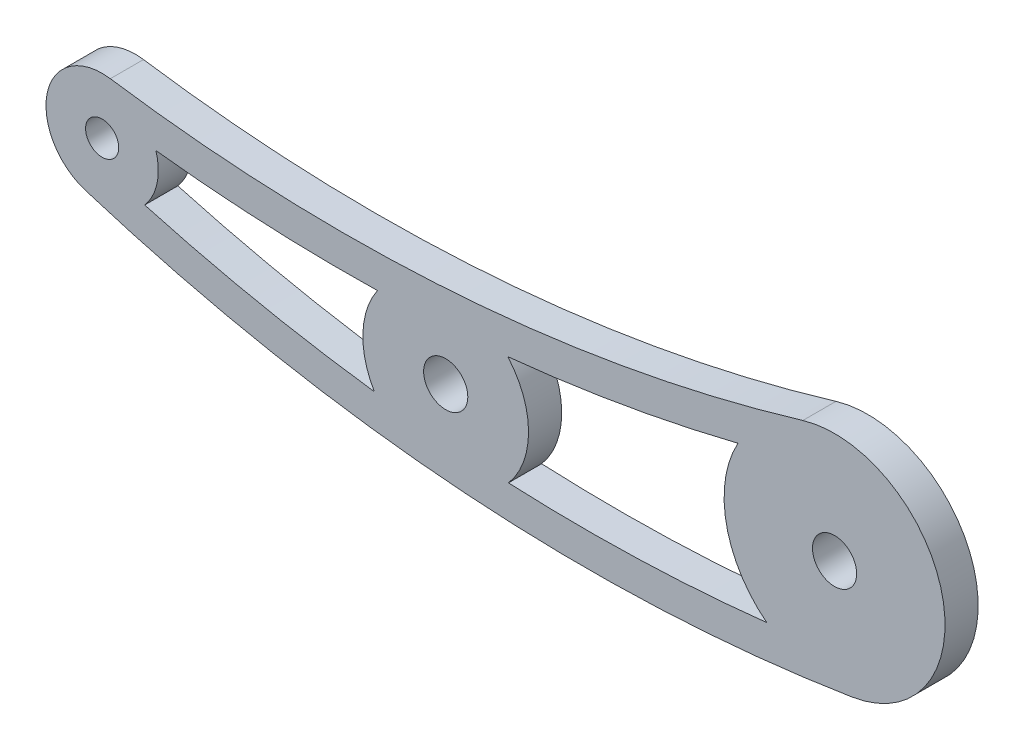
ISO-10303-21;
HEADER;
FILE_DESCRIPTION(('STEP AP214'),'2;1');
FILE_NAME('part.step','',(''),(''),'','','');
FILE_SCHEMA(('AUTOMOTIVE_DESIGN { 1 0 10303 214 1 1 1 1 }'));
ENDSEC;
DATA;
#1=APPLICATION_CONTEXT('core data for automotive mechanical design processes');
#2=APPLICATION_PROTOCOL_DEFINITION('international standard','automotive_design',2000,#1);
#3=PRODUCT_CONTEXT('',#1,'mechanical');
#4=PRODUCT('Part','Part','',(#3));
#5=PRODUCT_RELATED_PRODUCT_CATEGORY('part','',(#4));
#6=PRODUCT_DEFINITION_FORMATION('','',#4);
#7=PRODUCT_DEFINITION_CONTEXT('part definition',#1,'design');
#8=PRODUCT_DEFINITION('design','',#6,#7);
#9=PRODUCT_DEFINITION_SHAPE('','',#8);
#10=(LENGTH_UNIT() NAMED_UNIT(*) SI_UNIT(.MILLI.,.METRE.));
#11=(NAMED_UNIT(*) PLANE_ANGLE_UNIT() SI_UNIT($,.RADIAN.));
#12=(NAMED_UNIT(*) SI_UNIT($,.STERADIAN.) SOLID_ANGLE_UNIT());
#13=UNCERTAINTY_MEASURE_WITH_UNIT(LENGTH_MEASURE(1.E-05),#10,'distance_accuracy_value','');
#14=(GEOMETRIC_REPRESENTATION_CONTEXT(3) GLOBAL_UNCERTAINTY_ASSIGNED_CONTEXT((#13)) GLOBAL_UNIT_ASSIGNED_CONTEXT((#10,
#11,#12)) REPRESENTATION_CONTEXT('',''));
#15=CARTESIAN_POINT('',(0.,0.,0.));
#16=DIRECTION('',(0.,0.,1.));
#17=DIRECTION('',(1.,0.,0.));
#18=AXIS2_PLACEMENT_3D('',#15,#16,#17);
#19=CARTESIAN_POINT('',(0.,0.,3.));
#20=DIRECTION('',(0.,0.,-1.));
#21=DIRECTION('',(-1.,0.,0.));
#22=AXIS2_PLACEMENT_3D('',#19,#20,#21);
#23=CYLINDRICAL_SURFACE('',#22,5.08347455034873);
#24=DIRECTION('',(0.,0.,1.));
#25=VECTOR('',#24,1.);
#26=CARTESIAN_POINT('',(0.742030741321678,5.02902613663687,0.));
#27=LINE('',#26,#25);
#28=CARTESIAN_POINT('',(0.742030741321678,5.02902613663687,0.));
#29=VERTEX_POINT('',#28);
#30=CARTESIAN_POINT('',(0.742030741321678,5.02902613663687,3.));
#31=VERTEX_POINT('',#30);
#32=EDGE_CURVE('E179',#29,#31,#27,.T.);
#33=ORIENTED_EDGE('',*,*,#32,.F.);
#34=CARTESIAN_POINT('',(0.,0.,0.));
#35=DIRECTION('',(0.,0.,1.));
#36=DIRECTION('',(1.,0.,0.));
#37=AXIS2_PLACEMENT_3D('',#34,#35,#36);
#38=CIRCLE('',#37,5.08347455034873);
#39=CARTESIAN_POINT('',(-1.52361416751216,-4.84977456925589,0.));
#40=VERTEX_POINT('',#39);
#41=EDGE_CURVE('E189',#29,#40,#38,.T.);
#42=ORIENTED_EDGE('',*,*,#41,.T.);
#43=DIRECTION('',(0.,0.,1.));
#44=VECTOR('',#43,1.);
#45=CARTESIAN_POINT('',(-1.52361416751216,-4.84977456925589,0.));
#46=LINE('',#45,#44);
#47=CARTESIAN_POINT('',(-1.52361416751216,-4.84977456925589,3.));
#48=VERTEX_POINT('',#47);
#49=EDGE_CURVE('E192',#40,#48,#46,.T.);
#50=ORIENTED_EDGE('',*,*,#49,.T.);
#51=CARTESIAN_POINT('',(0.,0.,3.));
#52=DIRECTION('',(0.,0.,1.));
#53=DIRECTION('',(1.,0.,0.));
#54=AXIS2_PLACEMENT_3D('',#51,#52,#53);
#55=CIRCLE('',#54,5.08347455034873);
#56=EDGE_CURVE('E197',#31,#48,#55,.T.);
#57=ORIENTED_EDGE('',*,*,#56,.F.);
#58=EDGE_LOOP('',(#33,#42,#50,#57));
#59=FACE_BOUND('',#58,.T.);
#60=ADVANCED_FACE('F32',(#59),#23,.T.);
#61=CARTESIAN_POINT('',(0.,0.,3.));
#62=DIRECTION('',(0.,0.,-1.));
#63=DIRECTION('',(-1.,0.,0.));
#64=AXIS2_PLACEMENT_3D('',#61,#62,#63);
#65=CYLINDRICAL_SURFACE('',#64,1.5);
#66=CARTESIAN_POINT('',(0.,0.,3.));
#67=DIRECTION('',(0.,0.,1.));
#68=DIRECTION('',(1.,0.,0.));
#69=AXIS2_PLACEMENT_3D('',#66,#67,#68);
#70=CIRCLE('',#69,1.5);
#71=CARTESIAN_POINT('',(1.5,0.,3.));
#72=VERTEX_POINT('',#71);
#73=EDGE_CURVE('E199',#72,#72,#70,.T.);
#74=ORIENTED_EDGE('',*,*,#73,.T.);
#75=EDGE_LOOP('',(#74));
#76=FACE_BOUND('',#75,.T.);
#77=CARTESIAN_POINT('',(0.,0.,0.));
#78=DIRECTION('',(0.,0.,1.));
#79=DIRECTION('',(1.,0.,0.));
#80=AXIS2_PLACEMENT_3D('',#77,#78,#79);
#81=CIRCLE('',#80,1.5);
#82=CARTESIAN_POINT('',(1.5,0.,0.));
#83=VERTEX_POINT('',#82);
#84=EDGE_CURVE('E208',#83,#83,#81,.T.);
#85=ORIENTED_EDGE('',*,*,#84,.F.);
#86=EDGE_LOOP('',(#85));
#87=FACE_BOUND('',#86,.T.);
#88=ADVANCED_FACE('F249',(#76,#87),#65,.F.);
#89=CARTESIAN_POINT('',(66.3,0.,3.));
#90=DIRECTION('',(0.,0.,-1.));
#91=DIRECTION('',(-1.,0.,0.));
#92=AXIS2_PLACEMENT_3D('',#89,#90,#91);
#93=CYLINDRICAL_SURFACE('',#92,2.);
#94=CARTESIAN_POINT('',(66.3,0.,3.));
#95=DIRECTION('',(0.,0.,1.));
#96=DIRECTION('',(1.,0.,0.));
#97=AXIS2_PLACEMENT_3D('',#94,#95,#96);
#98=CIRCLE('',#97,2.);
#99=CARTESIAN_POINT('',(68.3,0.,3.));
#100=VERTEX_POINT('',#99);
#101=EDGE_CURVE('E203',#100,#100,#98,.T.);
#102=ORIENTED_EDGE('',*,*,#101,.T.);
#103=EDGE_LOOP('',(#102));
#104=FACE_BOUND('',#103,.T.);
#105=CARTESIAN_POINT('',(66.3,0.,0.));
#106=DIRECTION('',(0.,0.,1.));
#107=DIRECTION('',(1.,0.,0.));
#108=AXIS2_PLACEMENT_3D('',#105,#106,#107);
#109=CIRCLE('',#108,2.);
#110=CARTESIAN_POINT('',(68.3,0.,0.));
#111=VERTEX_POINT('',#110);
#112=EDGE_CURVE('E200',#111,#111,#109,.T.);
#113=ORIENTED_EDGE('',*,*,#112,.F.);
#114=EDGE_LOOP('',(#113));
#115=FACE_BOUND('',#114,.T.);
#116=ADVANCED_FACE('F254',(#104,#115),#93,.F.);
#117=CARTESIAN_POINT('',(33.1500000000001,-229.725921356237,3.));
#118=DIRECTION('',(0.,0.,1.));
#119=DIRECTION('',(1.,0.,0.));
#120=AXIS2_PLACEMENT_3D('',#117,#118,#119);
#121=PLANE('',#120);
#122=CARTESIAN_POINT('',(31.1,-3.74,3.));
#123=DIRECTION('',(0.,0.,1.));
#124=DIRECTION('',(1.,0.,0.));
#125=AXIS2_PLACEMENT_3D('',#122,#123,#124);
#126=CIRCLE('',#125,2.);
#127=CARTESIAN_POINT('',(33.1,-3.74,3.));
#128=VERTEX_POINT('',#127);
#129=EDGE_CURVE('E389',#128,#128,#126,.T.);
#130=ORIENTED_EDGE('',*,*,#129,.F.);
#131=EDGE_LOOP('',(#130));
#132=FACE_BOUND('',#131,.T.);
#133=CARTESIAN_POINT('',(43.806101944885,139.438004529346,3.));
#134=DIRECTION('',(0.,0.,1.));
#135=DIRECTION('',(1.,0.,0.));
#136=AXIS2_PLACEMENT_3D('',#133,#134,#135);
#137=CIRCLE('',#136,148.240690159882);
#138=CARTESIAN_POINT('',(3.85218516838753,-3.3169840114924,3.));
#139=VERTEX_POINT('',#138);
#140=CARTESIAN_POINT('',(24.6452263393288,-7.5591487257649,3.));
#141=VERTEX_POINT('',#140);
#142=EDGE_CURVE('E47',#139,#141,#137,.T.);
#143=ORIENTED_EDGE('',*,*,#142,.F.);
#144=CARTESIAN_POINT('',(0.,0.,3.));
#145=DIRECTION('',(0.,0.,-1.));
#146=DIRECTION('',(1.,0.,0.));
#147=AXIS2_PLACEMENT_3D('',#144,#145,#146);
#148=CIRCLE('',#147,5.08347455034852);
#149=CARTESIAN_POINT('',(4.86926369041765,1.46013171228607,3.));
#150=VERTEX_POINT('',#149);
#151=EDGE_CURVE('E140',#150,#139,#148,.T.);
#152=ORIENTED_EDGE('',*,*,#151,.F.);
#153=CARTESIAN_POINT('',(21.8615379379878,148.164003935193,3.));
#154=DIRECTION('',(0.,0.,-1.));
#155=DIRECTION('',(1.,0.,0.));
#156=AXIS2_PLACEMENT_3D('',#153,#154,#155);
#157=CIRCLE('',#156,147.684675946083);
#158=CARTESIAN_POINT('',(24.9211005926827,0.511023654869408,3.));
#159=VERTEX_POINT('',#158);
#160=EDGE_CURVE('E124',#159,#150,#157,.T.);
#161=ORIENTED_EDGE('',*,*,#160,.F.);
#162=CARTESIAN_POINT('',(31.1,-3.74,3.));
#163=DIRECTION('',(0.,0.,-1.));
#164=DIRECTION('',(1.,0.,0.));
#165=AXIS2_PLACEMENT_3D('',#162,#163,#164);
#166=CIRCLE('',#165,7.50000000000038);
#167=EDGE_CURVE('E133',#141,#159,#166,.T.);
#168=ORIENTED_EDGE('',*,*,#167,.F.);
#169=EDGE_LOOP('',(#143,#152,#161,#168));
#170=FACE_BOUND('',#169,.T.);
#171=CARTESIAN_POINT('',(31.1,-3.74,3.));
#172=DIRECTION('',(0.,0.,-1.));
#173=DIRECTION('',(1.,0.,0.));
#174=AXIS2_PLACEMENT_3D('',#171,#172,#173);
#175=CIRCLE('',#174,7.50000000000039);
#176=CARTESIAN_POINT('',(36.7181888125933,1.22849619764948,3.));
#177=VERTEX_POINT('',#176);
#178=CARTESIAN_POINT('',(36.781348533757,-8.63614938885476,3.));
#179=VERTEX_POINT('',#178);
#180=EDGE_CURVE('E147',#177,#179,#175,.T.);
#181=ORIENTED_EDGE('',*,*,#180,.F.);
#182=CARTESIAN_POINT('',(21.8615379379878,148.164003935193,3.));
#183=DIRECTION('',(0.,0.,-1.));
#184=DIRECTION('',(1.,0.,0.));
#185=AXIS2_PLACEMENT_3D('',#182,#183,#184);
#186=CIRCLE('',#185,147.684675946083);
#187=CARTESIAN_POINT('',(57.5596995290634,4.85871872799246,3.));
#188=VERTEX_POINT('',#187);
#189=EDGE_CURVE('E157',#188,#177,#186,.T.);
#190=ORIENTED_EDGE('',*,*,#189,.F.);
#191=CARTESIAN_POINT('',(66.3,0.,3.));
#192=DIRECTION('',(0.,0.,-1.));
#193=DIRECTION('',(1.,0.,0.));
#194=AXIS2_PLACEMENT_3D('',#191,#192,#193);
#195=CIRCLE('',#194,9.99999999999996);
#196=CARTESIAN_POINT('',(60.1653847937653,-7.89724611946679,3.));
#197=VERTEX_POINT('',#196);
#198=EDGE_CURVE('E154',#197,#188,#195,.T.);
#199=ORIENTED_EDGE('',*,*,#198,.F.);
#200=CARTESIAN_POINT('',(43.806101944885,139.438004529346,3.));
#201=DIRECTION('',(0.,0.,1.));
#202=DIRECTION('',(1.,0.,0.));
#203=AXIS2_PLACEMENT_3D('',#200,#201,#202);
#204=CIRCLE('',#203,148.240690159882);
#205=EDGE_CURVE('E151',#179,#197,#204,.T.);
#206=ORIENTED_EDGE('',*,*,#205,.F.);
#207=EDGE_LOOP('',(#181,#190,#199,#206));
#208=FACE_BOUND('',#207,.T.);
#209=ORIENTED_EDGE('',*,*,#56,.T.);
#210=CARTESIAN_POINT('',(43.806101944885,139.438004529346,3.));
#211=DIRECTION('',(0.,0.,1.));
#212=DIRECTION('',(1.,0.,0.));
#213=AXIS2_PLACEMENT_3D('',#210,#211,#212);
#214=CIRCLE('',#213,151.240690159882);
#215=CARTESIAN_POINT('',(67.8925933263036,-9.872367826262,3.));
#216=VERTEX_POINT('',#215);
#217=EDGE_CURVE('E182',#216,#48,#214,.F.);
#218=ORIENTED_EDGE('',*,*,#217,.F.);
#219=CARTESIAN_POINT('',(66.3,0.,3.));
#220=DIRECTION('',(0.,0.,1.));
#221=DIRECTION('',(1.,0.,0.));
#222=AXIS2_PLACEMENT_3D('',#219,#220,#221);
#223=CIRCLE('',#222,10.);
#224=CARTESIAN_POINT('',(63.4271580852972,9.57845391141634,3.));
#225=VERTEX_POINT('',#224);
#226=EDGE_CURVE('E173',#216,#225,#223,.T.);
#227=ORIENTED_EDGE('',*,*,#226,.T.);
#228=CARTESIAN_POINT('',(21.8615379379878,148.164003935193,3.));
#229=DIRECTION('',(0.,0.,1.));
#230=DIRECTION('',(1.,0.,0.));
#231=AXIS2_PLACEMENT_3D('',#228,#229,#230);
#232=CIRCLE('',#231,144.684675946083);
#233=EDGE_CURVE('E163',#31,#225,#232,.T.);
#234=ORIENTED_EDGE('',*,*,#233,.F.);
#235=EDGE_LOOP('',(#209,#218,#227,#234));
#236=FACE_BOUND('',#235,.T.);
#237=ORIENTED_EDGE('',*,*,#73,.F.);
#238=EDGE_LOOP('',(#237));
#239=FACE_BOUND('',#238,.T.);
#240=ORIENTED_EDGE('',*,*,#101,.F.);
#241=EDGE_LOOP('',(#240));
#242=FACE_BOUND('',#241,.T.);
#243=ADVANCED_FACE('F137',(#132,#170,#208,#236,#239,#242),#121,.T.);
#244=CARTESIAN_POINT('',(33.1500000000001,-229.725921356237,0.));
#245=DIRECTION('',(0.,0.,1.));
#246=DIRECTION('',(1.,0.,0.));
#247=AXIS2_PLACEMENT_3D('',#244,#245,#246);
#248=PLANE('',#247);
#249=CARTESIAN_POINT('',(31.1,-3.74,0.));
#250=DIRECTION('',(0.,0.,1.));
#251=DIRECTION('',(1.,0.,0.));
#252=AXIS2_PLACEMENT_3D('',#249,#250,#251);
#253=CIRCLE('',#252,2.);
#254=CARTESIAN_POINT('',(33.1,-3.74,0.));
#255=VERTEX_POINT('',#254);
#256=EDGE_CURVE('E35',#255,#255,#253,.T.);
#257=ORIENTED_EDGE('',*,*,#256,.T.);
#258=EDGE_LOOP('',(#257));
#259=FACE_BOUND('',#258,.T.);
#260=CARTESIAN_POINT('',(0.,0.,0.));
#261=DIRECTION('',(0.,0.,1.));
#262=DIRECTION('',(1.,0.,0.));
#263=AXIS2_PLACEMENT_3D('',#260,#261,#262);
#264=CIRCLE('',#263,5.08347455034852);
#265=CARTESIAN_POINT('',(4.86926369041765,1.46013171228607,0.));
#266=VERTEX_POINT('',#265);
#267=CARTESIAN_POINT('',(3.85218516838753,-3.3169840114924,0.));
#268=VERTEX_POINT('',#267);
#269=EDGE_CURVE('E40',#266,#268,#264,.F.);
#270=ORIENTED_EDGE('',*,*,#269,.T.);
#271=CARTESIAN_POINT('',(43.806101944885,139.438004529346,0.));
#272=DIRECTION('',(0.,0.,1.));
#273=DIRECTION('',(1.,0.,0.));
#274=AXIS2_PLACEMENT_3D('',#271,#272,#273);
#275=CIRCLE('',#274,148.240690159882);
#276=CARTESIAN_POINT('',(24.6452263393288,-7.5591487257649,0.));
#277=VERTEX_POINT('',#276);
#278=EDGE_CURVE('E11',#268,#277,#275,.T.);
#279=ORIENTED_EDGE('',*,*,#278,.T.);
#280=CARTESIAN_POINT('',(31.1,-3.74,0.));
#281=DIRECTION('',(0.,0.,1.));
#282=DIRECTION('',(1.,0.,0.));
#283=AXIS2_PLACEMENT_3D('',#280,#281,#282);
#284=CIRCLE('',#283,7.50000000000038);
#285=CARTESIAN_POINT('',(24.9211005926827,0.511023654869408,0.));
#286=VERTEX_POINT('',#285);
#287=EDGE_CURVE('E224',#277,#286,#284,.F.);
#288=ORIENTED_EDGE('',*,*,#287,.T.);
#289=CARTESIAN_POINT('',(21.8615379379878,148.164003935193,0.));
#290=DIRECTION('',(0.,0.,1.));
#291=DIRECTION('',(1.,0.,0.));
#292=AXIS2_PLACEMENT_3D('',#289,#290,#291);
#293=CIRCLE('',#292,147.684675946083);
#294=EDGE_CURVE('E127',#286,#266,#293,.F.);
#295=ORIENTED_EDGE('',*,*,#294,.T.);
#296=EDGE_LOOP('',(#270,#279,#288,#295));
#297=FACE_BOUND('',#296,.T.);
#298=CARTESIAN_POINT('',(21.8615379379878,148.164003935193,0.));
#299=DIRECTION('',(0.,0.,1.));
#300=DIRECTION('',(1.,0.,0.));
#301=AXIS2_PLACEMENT_3D('',#298,#299,#300);
#302=CIRCLE('',#301,147.684675946083);
#303=CARTESIAN_POINT('',(57.5596995290634,4.85871872799246,0.));
#304=VERTEX_POINT('',#303);
#305=CARTESIAN_POINT('',(36.7181888125933,1.22849619764948,0.));
#306=VERTEX_POINT('',#305);
#307=EDGE_CURVE('E218',#304,#306,#302,.F.);
#308=ORIENTED_EDGE('',*,*,#307,.T.);
#309=CARTESIAN_POINT('',(31.1,-3.74,0.));
#310=DIRECTION('',(0.,0.,1.));
#311=DIRECTION('',(1.,0.,0.));
#312=AXIS2_PLACEMENT_3D('',#309,#310,#311);
#313=CIRCLE('',#312,7.50000000000039);
#314=CARTESIAN_POINT('',(36.781348533757,-8.63614938885476,0.));
#315=VERTEX_POINT('',#314);
#316=EDGE_CURVE('E221',#306,#315,#313,.F.);
#317=ORIENTED_EDGE('',*,*,#316,.T.);
#318=CARTESIAN_POINT('',(43.806101944885,139.438004529346,0.));
#319=DIRECTION('',(0.,0.,1.));
#320=DIRECTION('',(1.,0.,0.));
#321=AXIS2_PLACEMENT_3D('',#318,#319,#320);
#322=CIRCLE('',#321,148.240690159882);
#323=CARTESIAN_POINT('',(60.1653847937653,-7.89724611946679,0.));
#324=VERTEX_POINT('',#323);
#325=EDGE_CURVE('E206',#315,#324,#322,.T.);
#326=ORIENTED_EDGE('',*,*,#325,.T.);
#327=CARTESIAN_POINT('',(66.3,0.,0.));
#328=DIRECTION('',(0.,0.,1.));
#329=DIRECTION('',(1.,0.,0.));
#330=AXIS2_PLACEMENT_3D('',#327,#328,#329);
#331=CIRCLE('',#330,9.99999999999996);
#332=EDGE_CURVE('E215',#324,#304,#331,.F.);
#333=ORIENTED_EDGE('',*,*,#332,.T.);
#334=EDGE_LOOP('',(#308,#317,#326,#333));
#335=FACE_BOUND('',#334,.T.);
#336=CARTESIAN_POINT('',(43.806101944885,139.438004529346,0.));
#337=DIRECTION('',(0.,0.,1.));
#338=DIRECTION('',(1.,0.,0.));
#339=AXIS2_PLACEMENT_3D('',#336,#337,#338);
#340=CIRCLE('',#339,151.240690159882);
#341=CARTESIAN_POINT('',(67.8925933263036,-9.872367826262,0.));
#342=VERTEX_POINT('',#341);
#343=EDGE_CURVE('E172',#342,#40,#340,.F.);
#344=ORIENTED_EDGE('',*,*,#343,.T.);
#345=ORIENTED_EDGE('',*,*,#41,.F.);
#346=CARTESIAN_POINT('',(21.8615379379878,148.164003935193,0.));
#347=DIRECTION('',(0.,0.,1.));
#348=DIRECTION('',(1.,0.,0.));
#349=AXIS2_PLACEMENT_3D('',#346,#347,#348);
#350=CIRCLE('',#349,144.684675946083);
#351=CARTESIAN_POINT('',(63.4271580852972,9.57845391141634,0.));
#352=VERTEX_POINT('',#351);
#353=EDGE_CURVE('E170',#29,#352,#350,.T.);
#354=ORIENTED_EDGE('',*,*,#353,.T.);
#355=CARTESIAN_POINT('',(66.3,0.,0.));
#356=DIRECTION('',(0.,0.,1.));
#357=DIRECTION('',(1.,0.,0.));
#358=AXIS2_PLACEMENT_3D('',#355,#356,#357);
#359=CIRCLE('',#358,10.);
#360=EDGE_CURVE('E176',#342,#352,#359,.T.);
#361=ORIENTED_EDGE('',*,*,#360,.F.);
#362=EDGE_LOOP('',(#344,#345,#354,#361));
#363=FACE_BOUND('',#362,.T.);
#364=ORIENTED_EDGE('',*,*,#84,.T.);
#365=EDGE_LOOP('',(#364));
#366=FACE_BOUND('',#365,.T.);
#367=ORIENTED_EDGE('',*,*,#112,.T.);
#368=EDGE_LOOP('',(#367));
#369=FACE_BOUND('',#368,.T.);
#370=ADVANCED_FACE('F229',(#259,#297,#335,#363,#366,#369),#248,.F.);
#371=CARTESIAN_POINT('',(21.8615379379878,148.164003935193,0.));
#372=DIRECTION('',(0.,0.,1.));
#373=DIRECTION('',(1.,0.,0.));
#374=AXIS2_PLACEMENT_3D('',#371,#372,#373);
#375=CYLINDRICAL_SURFACE('',#374,144.684675946083);
#376=ORIENTED_EDGE('',*,*,#233,.T.);
#377=DIRECTION('',(0.,0.,1.));
#378=VECTOR('',#377,1.);
#379=CARTESIAN_POINT('',(63.4271580852972,9.57845391141634,0.));
#380=LINE('',#379,#378);
#381=EDGE_CURVE('E187',#352,#225,#380,.T.);
#382=ORIENTED_EDGE('',*,*,#381,.F.);
#383=ORIENTED_EDGE('',*,*,#353,.F.);
#384=ORIENTED_EDGE('',*,*,#32,.T.);
#385=EDGE_LOOP('',(#376,#382,#383,#384));
#386=FACE_BOUND('',#385,.T.);
#387=ADVANCED_FACE('F274',(#386),#375,.F.);
#388=CARTESIAN_POINT('',(66.3,0.,0.));
#389=DIRECTION('',(0.,0.,1.));
#390=DIRECTION('',(1.,0.,0.));
#391=AXIS2_PLACEMENT_3D('',#388,#389,#390);
#392=CYLINDRICAL_SURFACE('',#391,10.);
#393=ORIENTED_EDGE('',*,*,#226,.F.);
#394=DIRECTION('',(0.,0.,1.));
#395=VECTOR('',#394,1.);
#396=CARTESIAN_POINT('',(67.8925933263036,-9.872367826262,0.));
#397=LINE('',#396,#395);
#398=EDGE_CURVE('E190',#342,#216,#397,.T.);
#399=ORIENTED_EDGE('',*,*,#398,.F.);
#400=ORIENTED_EDGE('',*,*,#360,.T.);
#401=ORIENTED_EDGE('',*,*,#381,.T.);
#402=EDGE_LOOP('',(#393,#399,#400,#401));
#403=FACE_BOUND('',#402,.T.);
#404=ADVANCED_FACE('F273',(#403),#392,.T.);
#405=CARTESIAN_POINT('',(43.806101944885,139.438004529346,0.));
#406=DIRECTION('',(0.,0.,1.));
#407=DIRECTION('',(1.,0.,0.));
#408=AXIS2_PLACEMENT_3D('',#405,#406,#407);
#409=CYLINDRICAL_SURFACE('',#408,151.240690159882);
#410=ORIENTED_EDGE('',*,*,#217,.T.);
#411=ORIENTED_EDGE('',*,*,#49,.F.);
#412=ORIENTED_EDGE('',*,*,#343,.F.);
#413=ORIENTED_EDGE('',*,*,#398,.T.);
#414=EDGE_LOOP('',(#410,#411,#412,#413));
#415=FACE_BOUND('',#414,.T.);
#416=ADVANCED_FACE('F267',(#415),#409,.T.);
#417=CARTESIAN_POINT('',(31.1,-3.74,-2.));
#418=DIRECTION('',(0.,0.,1.));
#419=DIRECTION('',(1.,0.,0.));
#420=AXIS2_PLACEMENT_3D('',#417,#418,#419);
#421=CYLINDRICAL_SURFACE('',#420,7.50000000000039);
#422=DIRECTION('',(0.,0.,1.));
#423=VECTOR('',#422,1.);
#424=CARTESIAN_POINT('',(36.7181888125933,1.22849619764948,-2.));
#425=LINE('',#424,#423);
#426=EDGE_CURVE('E161',#306,#177,#425,.T.);
#427=ORIENTED_EDGE('',*,*,#426,.T.);
#428=ORIENTED_EDGE('',*,*,#180,.T.);
#429=DIRECTION('',(0.,0.,1.));
#430=VECTOR('',#429,1.);
#431=CARTESIAN_POINT('',(36.781348533757,-8.63614938885476,-2.));
#432=LINE('',#431,#430);
#433=EDGE_CURVE('E160',#315,#179,#432,.T.);
#434=ORIENTED_EDGE('',*,*,#433,.F.);
#435=ORIENTED_EDGE('',*,*,#316,.F.);
#436=EDGE_LOOP('',(#427,#428,#434,#435));
#437=FACE_BOUND('',#436,.T.);
#438=ADVANCED_FACE('F316',(#437),#421,.T.);
#439=CARTESIAN_POINT('',(21.8615379379878,148.164003935193,-2.));
#440=DIRECTION('',(0.,0.,1.));
#441=DIRECTION('',(1.,0.,0.));
#442=AXIS2_PLACEMENT_3D('',#439,#440,#441);
#443=CYLINDRICAL_SURFACE('',#442,147.684675946083);
#444=DIRECTION('',(0.,0.,1.));
#445=VECTOR('',#444,1.);
#446=CARTESIAN_POINT('',(57.5596995290634,4.85871872799246,-2.));
#447=LINE('',#446,#445);
#448=EDGE_CURVE('E164',#304,#188,#447,.T.);
#449=ORIENTED_EDGE('',*,*,#448,.T.);
#450=ORIENTED_EDGE('',*,*,#189,.T.);
#451=ORIENTED_EDGE('',*,*,#426,.F.);
#452=ORIENTED_EDGE('',*,*,#307,.F.);
#453=EDGE_LOOP('',(#449,#450,#451,#452));
#454=FACE_BOUND('',#453,.T.);
#455=ADVANCED_FACE('F321',(#454),#443,.T.);
#456=CARTESIAN_POINT('',(66.3,0.,-2.));
#457=DIRECTION('',(0.,0.,1.));
#458=DIRECTION('',(1.,0.,0.));
#459=AXIS2_PLACEMENT_3D('',#456,#457,#458);
#460=CYLINDRICAL_SURFACE('',#459,9.99999999999996);
#461=DIRECTION('',(0.,0.,1.));
#462=VECTOR('',#461,1.);
#463=CARTESIAN_POINT('',(60.1653847937653,-7.89724611946679,-2.));
#464=LINE('',#463,#462);
#465=EDGE_CURVE('E166',#324,#197,#464,.T.);
#466=ORIENTED_EDGE('',*,*,#465,.T.);
#467=ORIENTED_EDGE('',*,*,#198,.T.);
#468=ORIENTED_EDGE('',*,*,#448,.F.);
#469=ORIENTED_EDGE('',*,*,#332,.F.);
#470=EDGE_LOOP('',(#466,#467,#468,#469));
#471=FACE_BOUND('',#470,.T.);
#472=ADVANCED_FACE('F243',(#471),#460,.T.);
#473=CARTESIAN_POINT('',(43.806101944885,139.438004529346,-2.));
#474=DIRECTION('',(0.,0.,1.));
#475=DIRECTION('',(1.,0.,0.));
#476=AXIS2_PLACEMENT_3D('',#473,#474,#475);
#477=CYLINDRICAL_SURFACE('',#476,148.240690159882);
#478=ORIENTED_EDGE('',*,*,#433,.T.);
#479=ORIENTED_EDGE('',*,*,#205,.T.);
#480=ORIENTED_EDGE('',*,*,#465,.F.);
#481=ORIENTED_EDGE('',*,*,#325,.F.);
#482=EDGE_LOOP('',(#478,#479,#480,#481));
#483=FACE_BOUND('',#482,.T.);
#484=ADVANCED_FACE('F236',(#483),#477,.F.);
#485=CARTESIAN_POINT('',(43.806101944885,139.438004529346,-2.));
#486=DIRECTION('',(0.,0.,1.));
#487=DIRECTION('',(1.,0.,0.));
#488=AXIS2_PLACEMENT_3D('',#485,#486,#487);
#489=CYLINDRICAL_SURFACE('',#488,148.240690159882);
#490=DIRECTION('',(0.,0.,1.));
#491=VECTOR('',#490,1.);
#492=CARTESIAN_POINT('',(3.85218516838753,-3.3169840114924,-2.));
#493=LINE('',#492,#491);
#494=EDGE_CURVE('E145',#268,#139,#493,.T.);
#495=ORIENTED_EDGE('',*,*,#494,.T.);
#496=ORIENTED_EDGE('',*,*,#142,.T.);
#497=DIRECTION('',(0.,0.,1.));
#498=VECTOR('',#497,1.);
#499=CARTESIAN_POINT('',(24.6452263393288,-7.5591487257649,-2.));
#500=LINE('',#499,#498);
#501=EDGE_CURVE('E130',#277,#141,#500,.T.);
#502=ORIENTED_EDGE('',*,*,#501,.F.);
#503=ORIENTED_EDGE('',*,*,#278,.F.);
#504=EDGE_LOOP('',(#495,#496,#502,#503));
#505=FACE_BOUND('',#504,.T.);
#506=ADVANCED_FACE('F234',(#505),#489,.F.);
#507=CARTESIAN_POINT('',(0.,0.,-2.));
#508=DIRECTION('',(0.,0.,1.));
#509=DIRECTION('',(1.,0.,0.));
#510=AXIS2_PLACEMENT_3D('',#507,#508,#509);
#511=CYLINDRICAL_SURFACE('',#510,5.08347455034852);
#512=DIRECTION('',(0.,0.,1.));
#513=VECTOR('',#512,1.);
#514=CARTESIAN_POINT('',(4.86926369041765,1.46013171228607,-2.));
#515=LINE('',#514,#513);
#516=EDGE_CURVE('E129',#266,#150,#515,.T.);
#517=ORIENTED_EDGE('',*,*,#516,.T.);
#518=ORIENTED_EDGE('',*,*,#151,.T.);
#519=ORIENTED_EDGE('',*,*,#494,.F.);
#520=ORIENTED_EDGE('',*,*,#269,.F.);
#521=EDGE_LOOP('',(#517,#518,#519,#520));
#522=FACE_BOUND('',#521,.T.);
#523=ADVANCED_FACE('F233',(#522),#511,.T.);
#524=CARTESIAN_POINT('',(21.8615379379878,148.164003935193,-2.));
#525=DIRECTION('',(0.,0.,1.));
#526=DIRECTION('',(1.,0.,0.));
#527=AXIS2_PLACEMENT_3D('',#524,#525,#526);
#528=CYLINDRICAL_SURFACE('',#527,147.684675946083);
#529=DIRECTION('',(0.,0.,1.));
#530=VECTOR('',#529,1.);
#531=CARTESIAN_POINT('',(24.9211005926827,0.511023654869408,-2.));
#532=LINE('',#531,#530);
#533=EDGE_CURVE('E55',#286,#159,#532,.T.);
#534=ORIENTED_EDGE('',*,*,#533,.T.);
#535=ORIENTED_EDGE('',*,*,#160,.T.);
#536=ORIENTED_EDGE('',*,*,#516,.F.);
#537=ORIENTED_EDGE('',*,*,#294,.F.);
#538=EDGE_LOOP('',(#534,#535,#536,#537));
#539=FACE_BOUND('',#538,.T.);
#540=ADVANCED_FACE('F121',(#539),#528,.T.);
#541=CARTESIAN_POINT('',(31.1,-3.74,-2.));
#542=DIRECTION('',(0.,0.,1.));
#543=DIRECTION('',(1.,0.,0.));
#544=AXIS2_PLACEMENT_3D('',#541,#542,#543);
#545=CYLINDRICAL_SURFACE('',#544,7.50000000000038);
#546=ORIENTED_EDGE('',*,*,#501,.T.);
#547=ORIENTED_EDGE('',*,*,#167,.T.);
#548=ORIENTED_EDGE('',*,*,#533,.F.);
#549=ORIENTED_EDGE('',*,*,#287,.F.);
#550=EDGE_LOOP('',(#546,#547,#548,#549));
#551=FACE_BOUND('',#550,.T.);
#552=ADVANCED_FACE('F134',(#551),#545,.T.);
#553=CARTESIAN_POINT('',(31.1,-3.74,-2.));
#554=DIRECTION('',(0.,0.,1.));
#555=DIRECTION('',(1.,0.,0.));
#556=AXIS2_PLACEMENT_3D('',#553,#554,#555);
#557=CYLINDRICAL_SURFACE('',#556,2.);
#558=ORIENTED_EDGE('',*,*,#129,.T.);
#559=EDGE_LOOP('',(#558));
#560=FACE_BOUND('',#559,.T.);
#561=ORIENTED_EDGE('',*,*,#256,.F.);
#562=EDGE_LOOP('',(#561));
#563=FACE_BOUND('',#562,.T.);
#564=ADVANCED_FACE('F374',(#560,#563),#557,.F.);
#565=CLOSED_SHELL('',(#60,#88,#116,#243,#370,#387,#404,#416,#438,#455,#472,#484,#506,#523,#540,
#552,#564));
#566=MANIFOLD_SOLID_BREP('B2',#565);
#567=ADVANCED_BREP_SHAPE_REPRESENTATION('',(#18,#566),#14);
#568=SHAPE_DEFINITION_REPRESENTATION(#9,#567);
ENDSEC;
END-ISO-10303-21;
